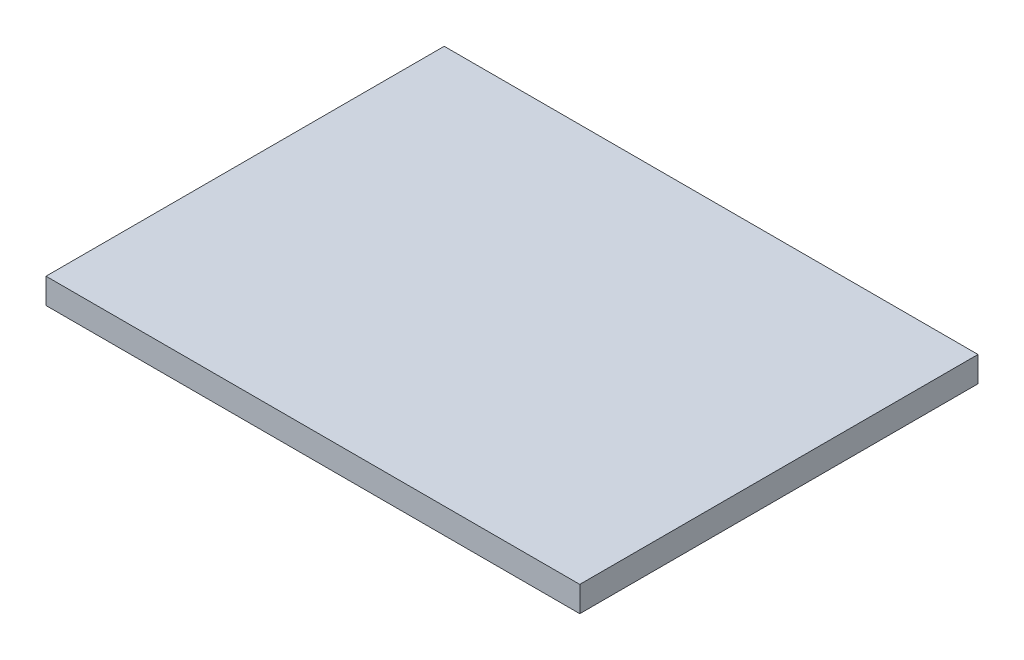
ISO-10303-21;
HEADER;
FILE_DESCRIPTION(('STEP AP214'),'2;1');
FILE_NAME('part.step','',(''),(''),'','','');
FILE_SCHEMA(('AUTOMOTIVE_DESIGN { 1 0 10303 214 1 1 1 1 }'));
ENDSEC;
DATA;
#1=APPLICATION_CONTEXT('core data for automotive mechanical design processes');
#2=APPLICATION_PROTOCOL_DEFINITION('international standard','automotive_design',2000,#1);
#3=PRODUCT_CONTEXT('',#1,'mechanical');
#4=PRODUCT('Part','Part','',(#3));
#5=PRODUCT_RELATED_PRODUCT_CATEGORY('part','',(#4));
#6=PRODUCT_DEFINITION_FORMATION('','',#4);
#7=PRODUCT_DEFINITION_CONTEXT('part definition',#1,'design');
#8=PRODUCT_DEFINITION('design','',#6,#7);
#9=PRODUCT_DEFINITION_SHAPE('','',#8);
#10=(LENGTH_UNIT() NAMED_UNIT(*) SI_UNIT(.MILLI.,.METRE.));
#11=(NAMED_UNIT(*) PLANE_ANGLE_UNIT() SI_UNIT($,.RADIAN.));
#12=(NAMED_UNIT(*) SI_UNIT($,.STERADIAN.) SOLID_ANGLE_UNIT());
#13=UNCERTAINTY_MEASURE_WITH_UNIT(LENGTH_MEASURE(1.E-05),#10,'distance_accuracy_value','');
#14=(GEOMETRIC_REPRESENTATION_CONTEXT(3) GLOBAL_UNCERTAINTY_ASSIGNED_CONTEXT((#13)) GLOBAL_UNIT_ASSIGNED_CONTEXT((#10,
#11,#12)) REPRESENTATION_CONTEXT('',''));
#15=CARTESIAN_POINT('',(0.,0.,0.));
#16=DIRECTION('',(0.,0.,1.));
#17=DIRECTION('',(1.,0.,0.));
#18=AXIS2_PLACEMENT_3D('',#15,#16,#17);
#19=CARTESIAN_POINT('',(315.,30.,-235.));
#20=DIRECTION('',(-1.,0.,0.));
#21=DIRECTION('',(0.,0.,1.));
#22=AXIS2_PLACEMENT_3D('',#19,#20,#21);
#23=PLANE('',#22);
#24=DIRECTION('',(0.,0.,-1.));
#25=VECTOR('',#24,1.);
#26=CARTESIAN_POINT('',(315.,0.,-235.));
#27=LINE('',#26,#25);
#28=CARTESIAN_POINT('',(315.,0.,235.));
#29=VERTEX_POINT('',#28);
#30=CARTESIAN_POINT('',(315.,0.,-235.));
#31=VERTEX_POINT('',#30);
#32=EDGE_CURVE('E109',#29,#31,#27,.T.);
#33=ORIENTED_EDGE('',*,*,#32,.T.);
#34=DIRECTION('',(0.,-1.,0.));
#35=VECTOR('',#34,1.);
#36=CARTESIAN_POINT('',(315.,30.,-235.));
#37=LINE('',#36,#35);
#38=CARTESIAN_POINT('',(315.,30.,-235.));
#39=VERTEX_POINT('',#38);
#40=EDGE_CURVE('E11',#39,#31,#37,.T.);
#41=ORIENTED_EDGE('',*,*,#40,.F.);
#42=DIRECTION('',(0.,0.,-1.));
#43=VECTOR('',#42,1.);
#44=CARTESIAN_POINT('',(315.,30.,-235.));
#45=LINE('',#44,#43);
#46=CARTESIAN_POINT('',(315.,30.,235.));
#47=VERTEX_POINT('',#46);
#48=EDGE_CURVE('E93',#47,#39,#45,.T.);
#49=ORIENTED_EDGE('',*,*,#48,.F.);
#50=DIRECTION('',(0.,-1.,0.));
#51=VECTOR('',#50,1.);
#52=CARTESIAN_POINT('',(315.,30.,235.));
#53=LINE('',#52,#51);
#54=EDGE_CURVE('E105',#47,#29,#53,.T.);
#55=ORIENTED_EDGE('',*,*,#54,.T.);
#56=EDGE_LOOP('',(#33,#41,#49,#55));
#57=FACE_BOUND('',#56,.T.);
#58=ADVANCED_FACE('F41',(#57),#23,.F.);
#59=CARTESIAN_POINT('',(-315.,30.,-235.));
#60=DIRECTION('',(0.,0.,1.));
#61=DIRECTION('',(1.,0.,0.));
#62=AXIS2_PLACEMENT_3D('',#59,#60,#61);
#63=PLANE('',#62);
#64=DIRECTION('',(-1.,0.,0.));
#65=VECTOR('',#64,1.);
#66=CARTESIAN_POINT('',(-315.,0.,-235.));
#67=LINE('',#66,#65);
#68=CARTESIAN_POINT('',(-315.,0.,-235.));
#69=VERTEX_POINT('',#68);
#70=EDGE_CURVE('E98',#31,#69,#67,.T.);
#71=ORIENTED_EDGE('',*,*,#70,.T.);
#72=DIRECTION('',(0.,-1.,0.));
#73=VECTOR('',#72,1.);
#74=CARTESIAN_POINT('',(-315.,30.,-235.));
#75=LINE('',#74,#73);
#76=CARTESIAN_POINT('',(-315.,30.,-235.));
#77=VERTEX_POINT('',#76);
#78=EDGE_CURVE('E50',#77,#69,#75,.T.);
#79=ORIENTED_EDGE('',*,*,#78,.F.);
#80=DIRECTION('',(-1.,0.,0.));
#81=VECTOR('',#80,1.);
#82=CARTESIAN_POINT('',(-315.,30.,-235.));
#83=LINE('',#82,#81);
#84=EDGE_CURVE('E88',#39,#77,#83,.T.);
#85=ORIENTED_EDGE('',*,*,#84,.F.);
#86=ORIENTED_EDGE('',*,*,#40,.T.);
#87=EDGE_LOOP('',(#71,#79,#85,#86));
#88=FACE_BOUND('',#87,.T.);
#89=ADVANCED_FACE('F97',(#88),#63,.F.);
#90=CARTESIAN_POINT('',(-315.,30.,-235.));
#91=DIRECTION('',(1.,0.,0.));
#92=DIRECTION('',(0.,0.,-1.));
#93=AXIS2_PLACEMENT_3D('',#90,#91,#92);
#94=PLANE('',#93);
#95=DIRECTION('',(0.,0.,1.));
#96=VECTOR('',#95,1.);
#97=CARTESIAN_POINT('',(-315.,0.,-235.));
#98=LINE('',#97,#96);
#99=CARTESIAN_POINT('',(-315.,0.,235.));
#100=VERTEX_POINT('',#99);
#101=EDGE_CURVE('E75',#69,#100,#98,.T.);
#102=ORIENTED_EDGE('',*,*,#101,.T.);
#103=DIRECTION('',(0.,-1.,0.));
#104=VECTOR('',#103,1.);
#105=CARTESIAN_POINT('',(-315.,30.,235.));
#106=LINE('',#105,#104);
#107=CARTESIAN_POINT('',(-315.,30.,235.));
#108=VERTEX_POINT('',#107);
#109=EDGE_CURVE('E100',#108,#100,#106,.T.);
#110=ORIENTED_EDGE('',*,*,#109,.F.);
#111=DIRECTION('',(0.,0.,1.));
#112=VECTOR('',#111,1.);
#113=CARTESIAN_POINT('',(-315.,30.,-235.));
#114=LINE('',#113,#112);
#115=EDGE_CURVE('E91',#77,#108,#114,.T.);
#116=ORIENTED_EDGE('',*,*,#115,.F.);
#117=ORIENTED_EDGE('',*,*,#78,.T.);
#118=EDGE_LOOP('',(#102,#110,#116,#117));
#119=FACE_BOUND('',#118,.T.);
#120=ADVANCED_FACE('F101',(#119),#94,.F.);
#121=CARTESIAN_POINT('',(-315.,30.,235.));
#122=DIRECTION('',(0.,0.,-1.));
#123=DIRECTION('',(-1.,0.,0.));
#124=AXIS2_PLACEMENT_3D('',#121,#122,#123);
#125=PLANE('',#124);
#126=DIRECTION('',(1.,0.,0.));
#127=VECTOR('',#126,1.);
#128=CARTESIAN_POINT('',(-315.,0.,235.));
#129=LINE('',#128,#127);
#130=EDGE_CURVE('E81',#100,#29,#129,.T.);
#131=ORIENTED_EDGE('',*,*,#130,.T.);
#132=ORIENTED_EDGE('',*,*,#54,.F.);
#133=DIRECTION('',(1.,0.,0.));
#134=VECTOR('',#133,1.);
#135=CARTESIAN_POINT('',(-315.,30.,235.));
#136=LINE('',#135,#134);
#137=EDGE_CURVE('E58',#108,#47,#136,.T.);
#138=ORIENTED_EDGE('',*,*,#137,.F.);
#139=ORIENTED_EDGE('',*,*,#109,.T.);
#140=EDGE_LOOP('',(#131,#132,#138,#139));
#141=FACE_BOUND('',#140,.T.);
#142=ADVANCED_FACE('F122',(#141),#125,.F.);
#143=CARTESIAN_POINT('',(0.,30.,0.));
#144=DIRECTION('',(0.,1.,0.));
#145=DIRECTION('',(0.,0.,1.));
#146=AXIS2_PLACEMENT_3D('',#143,#144,#145);
#147=PLANE('',#146);
#148=ORIENTED_EDGE('',*,*,#48,.T.);
#149=ORIENTED_EDGE('',*,*,#84,.T.);
#150=ORIENTED_EDGE('',*,*,#115,.T.);
#151=ORIENTED_EDGE('',*,*,#137,.T.);
#152=EDGE_LOOP('',(#148,#149,#150,#151));
#153=FACE_BOUND('',#152,.T.);
#154=ADVANCED_FACE('F89',(#153),#147,.T.);
#155=CARTESIAN_POINT('',(0.,0.,0.));
#156=DIRECTION('',(0.,1.,0.));
#157=DIRECTION('',(0.,0.,1.));
#158=AXIS2_PLACEMENT_3D('',#155,#156,#157);
#159=PLANE('',#158);
#160=ORIENTED_EDGE('',*,*,#32,.F.);
#161=ORIENTED_EDGE('',*,*,#130,.F.);
#162=ORIENTED_EDGE('',*,*,#101,.F.);
#163=ORIENTED_EDGE('',*,*,#70,.F.);
#164=EDGE_LOOP('',(#160,#161,#162,#163));
#165=FACE_BOUND('',#164,.T.);
#166=ADVANCED_FACE('F125',(#165),#159,.F.);
#167=CLOSED_SHELL('',(#58,#89,#120,#142,#154,#166));
#168=MANIFOLD_SOLID_BREP('B2',#167);
#169=ADVANCED_BREP_SHAPE_REPRESENTATION('',(#18,#168),#14);
#170=SHAPE_DEFINITION_REPRESENTATION(#9,#169);
ENDSEC;
END-ISO-10303-21;
